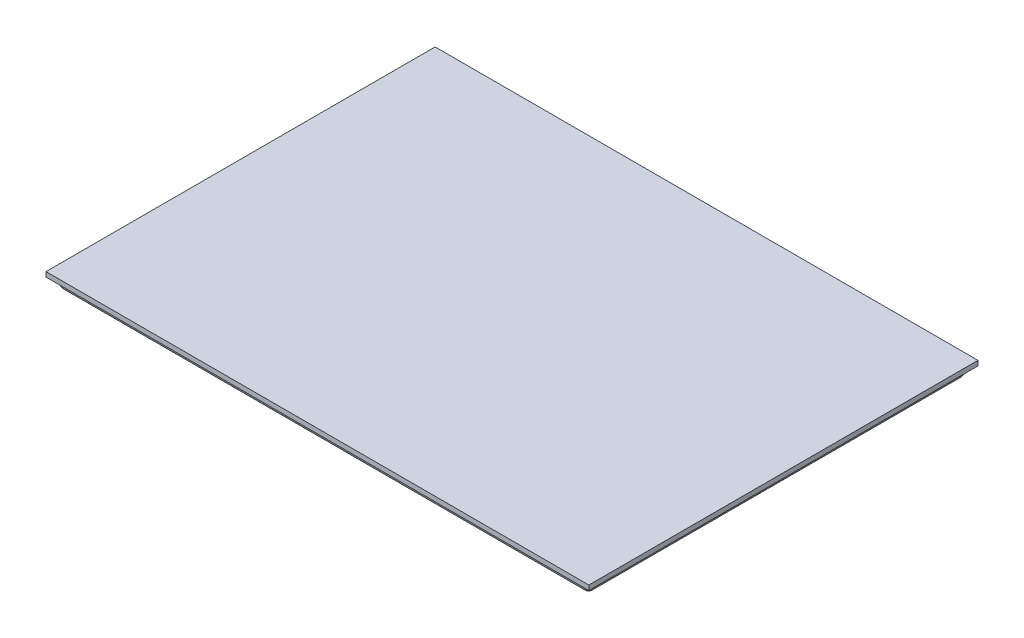
ISO-10303-21;
HEADER;
FILE_DESCRIPTION(('STEP AP214'),'2;1');
FILE_NAME('part.step','',(''),(''),'','','');
FILE_SCHEMA(('AUTOMOTIVE_DESIGN { 1 0 10303 214 1 1 1 1 }'));
ENDSEC;
DATA;
#1=APPLICATION_CONTEXT('core data for automotive mechanical design processes');
#2=APPLICATION_PROTOCOL_DEFINITION('international standard','automotive_design',2000,#1);
#3=PRODUCT_CONTEXT('',#1,'mechanical');
#4=PRODUCT('Part','Part','',(#3));
#5=PRODUCT_RELATED_PRODUCT_CATEGORY('part','',(#4));
#6=PRODUCT_DEFINITION_FORMATION('','',#4);
#7=PRODUCT_DEFINITION_CONTEXT('part definition',#1,'design');
#8=PRODUCT_DEFINITION('design','',#6,#7);
#9=PRODUCT_DEFINITION_SHAPE('','',#8);
#10=(LENGTH_UNIT() NAMED_UNIT(*) SI_UNIT(.MILLI.,.METRE.));
#11=(NAMED_UNIT(*) PLANE_ANGLE_UNIT() SI_UNIT($,.RADIAN.));
#12=(NAMED_UNIT(*) SI_UNIT($,.STERADIAN.) SOLID_ANGLE_UNIT());
#13=UNCERTAINTY_MEASURE_WITH_UNIT(LENGTH_MEASURE(1.E-05),#10,'distance_accuracy_value','');
#14=(GEOMETRIC_REPRESENTATION_CONTEXT(3) GLOBAL_UNCERTAINTY_ASSIGNED_CONTEXT((#13)) GLOBAL_UNIT_ASSIGNED_CONTEXT((#10,
#11,#12)) REPRESENTATION_CONTEXT('',''));
#15=CARTESIAN_POINT('',(0.,0.,0.));
#16=DIRECTION('',(0.,0.,1.));
#17=DIRECTION('',(1.,0.,0.));
#18=AXIS2_PLACEMENT_3D('',#15,#16,#17);
#19=CARTESIAN_POINT('',(56.5,1.,40.5));
#20=DIRECTION('',(-1.,0.,0.));
#21=DIRECTION('',(0.,0.,1.));
#22=AXIS2_PLACEMENT_3D('',#19,#20,#21);
#23=PLANE('',#22);
#24=DIRECTION('',(0.,0.,-1.));
#25=VECTOR('',#24,1.);
#26=CARTESIAN_POINT('',(56.5,0.,40.5));
#27=LINE('',#26,#25);
#28=CARTESIAN_POINT('',(56.5,0.,40.5));
#29=VERTEX_POINT('',#28);
#30=CARTESIAN_POINT('',(56.5,0.,-40.5));
#31=VERTEX_POINT('',#30);
#32=EDGE_CURVE('E158',#29,#31,#27,.T.);
#33=ORIENTED_EDGE('',*,*,#32,.T.);
#34=DIRECTION('',(0.,-1.,0.));
#35=VECTOR('',#34,1.);
#36=CARTESIAN_POINT('',(56.5,1.,-40.5));
#37=LINE('',#36,#35);
#38=CARTESIAN_POINT('',(56.5,1.,-40.5));
#39=VERTEX_POINT('',#38);
#40=EDGE_CURVE('E139',#39,#31,#37,.T.);
#41=ORIENTED_EDGE('',*,*,#40,.F.);
#42=DIRECTION('',(0.,0.,-1.));
#43=VECTOR('',#42,1.);
#44=CARTESIAN_POINT('',(56.5,1.,40.5));
#45=LINE('',#44,#43);
#46=CARTESIAN_POINT('',(56.5,1.,40.5));
#47=VERTEX_POINT('',#46);
#48=EDGE_CURVE('E146',#47,#39,#45,.T.);
#49=ORIENTED_EDGE('',*,*,#48,.F.);
#50=DIRECTION('',(0.,-1.,0.));
#51=VECTOR('',#50,1.);
#52=CARTESIAN_POINT('',(56.5,1.,40.5));
#53=LINE('',#52,#51);
#54=EDGE_CURVE('E250',#47,#29,#53,.T.);
#55=ORIENTED_EDGE('',*,*,#54,.T.);
#56=EDGE_LOOP('',(#33,#41,#49,#55));
#57=FACE_BOUND('',#56,.T.);
#58=ADVANCED_FACE('F33',(#57),#23,.F.);
#59=CARTESIAN_POINT('',(-56.5,1.,-40.5));
#60=DIRECTION('',(0.,0.,1.));
#61=DIRECTION('',(1.,0.,0.));
#62=AXIS2_PLACEMENT_3D('',#59,#60,#61);
#63=PLANE('',#62);
#64=DIRECTION('',(-1.,0.,0.));
#65=VECTOR('',#64,1.);
#66=CARTESIAN_POINT('',(-56.5,0.,-40.5));
#67=LINE('',#66,#65);
#68=CARTESIAN_POINT('',(-56.5,0.,-40.5));
#69=VERTEX_POINT('',#68);
#70=EDGE_CURVE('E252',#31,#69,#67,.T.);
#71=ORIENTED_EDGE('',*,*,#70,.T.);
#72=DIRECTION('',(0.,-1.,0.));
#73=VECTOR('',#72,1.);
#74=CARTESIAN_POINT('',(-56.5,1.,-40.5));
#75=LINE('',#74,#73);
#76=CARTESIAN_POINT('',(-56.5,1.,-40.5));
#77=VERTEX_POINT('',#76);
#78=EDGE_CURVE('E142',#77,#69,#75,.T.);
#79=ORIENTED_EDGE('',*,*,#78,.F.);
#80=DIRECTION('',(-1.,0.,0.));
#81=VECTOR('',#80,1.);
#82=CARTESIAN_POINT('',(-56.5,1.,-40.5));
#83=LINE('',#82,#81);
#84=EDGE_CURVE('E135',#39,#77,#83,.T.);
#85=ORIENTED_EDGE('',*,*,#84,.F.);
#86=ORIENTED_EDGE('',*,*,#40,.T.);
#87=EDGE_LOOP('',(#71,#79,#85,#86));
#88=FACE_BOUND('',#87,.T.);
#89=ADVANCED_FACE('F137',(#88),#63,.F.);
#90=CARTESIAN_POINT('',(-56.5,1.,40.5));
#91=DIRECTION('',(1.,0.,0.));
#92=DIRECTION('',(0.,0.,-1.));
#93=AXIS2_PLACEMENT_3D('',#90,#91,#92);
#94=PLANE('',#93);
#95=DIRECTION('',(0.,0.,1.));
#96=VECTOR('',#95,1.);
#97=CARTESIAN_POINT('',(-56.5,0.,40.5));
#98=LINE('',#97,#96);
#99=CARTESIAN_POINT('',(-56.5,0.,40.5));
#100=VERTEX_POINT('',#99);
#101=EDGE_CURVE('E254',#69,#100,#98,.T.);
#102=ORIENTED_EDGE('',*,*,#101,.T.);
#103=DIRECTION('',(0.,-1.,0.));
#104=VECTOR('',#103,1.);
#105=CARTESIAN_POINT('',(-56.5,1.,40.5));
#106=LINE('',#105,#104);
#107=CARTESIAN_POINT('',(-56.5,1.,40.5));
#108=VERTEX_POINT('',#107);
#109=EDGE_CURVE('E163',#108,#100,#106,.T.);
#110=ORIENTED_EDGE('',*,*,#109,.F.);
#111=DIRECTION('',(0.,0.,1.));
#112=VECTOR('',#111,1.);
#113=CARTESIAN_POINT('',(-56.5,1.,40.5));
#114=LINE('',#113,#112);
#115=EDGE_CURVE('E145',#77,#108,#114,.T.);
#116=ORIENTED_EDGE('',*,*,#115,.F.);
#117=ORIENTED_EDGE('',*,*,#78,.T.);
#118=EDGE_LOOP('',(#102,#110,#116,#117));
#119=FACE_BOUND('',#118,.T.);
#120=ADVANCED_FACE('F266',(#119),#94,.F.);
#121=CARTESIAN_POINT('',(-56.5,1.,40.5));
#122=DIRECTION('',(0.,0.,-1.));
#123=DIRECTION('',(-1.,0.,0.));
#124=AXIS2_PLACEMENT_3D('',#121,#122,#123);
#125=PLANE('',#124);
#126=DIRECTION('',(1.,0.,0.));
#127=VECTOR('',#126,1.);
#128=CARTESIAN_POINT('',(-56.5,0.,40.5));
#129=LINE('',#128,#127);
#130=EDGE_CURVE('E155',#100,#29,#129,.T.);
#131=ORIENTED_EDGE('',*,*,#130,.T.);
#132=ORIENTED_EDGE('',*,*,#54,.F.);
#133=DIRECTION('',(1.,0.,0.));
#134=VECTOR('',#133,1.);
#135=CARTESIAN_POINT('',(-56.5,1.,40.5));
#136=LINE('',#135,#134);
#137=EDGE_CURVE('E151',#108,#47,#136,.T.);
#138=ORIENTED_EDGE('',*,*,#137,.F.);
#139=ORIENTED_EDGE('',*,*,#109,.T.);
#140=EDGE_LOOP('',(#131,#132,#138,#139));
#141=FACE_BOUND('',#140,.T.);
#142=ADVANCED_FACE('F261',(#141),#125,.F.);
#143=CARTESIAN_POINT('',(0.,1.,0.));
#144=DIRECTION('',(0.,-1.,0.));
#145=DIRECTION('',(0.,0.,-1.));
#146=AXIS2_PLACEMENT_3D('',#143,#144,#145);
#147=PLANE('',#146);
#148=ORIENTED_EDGE('',*,*,#48,.T.);
#149=ORIENTED_EDGE('',*,*,#84,.T.);
#150=ORIENTED_EDGE('',*,*,#115,.T.);
#151=ORIENTED_EDGE('',*,*,#137,.T.);
#152=EDGE_LOOP('',(#148,#149,#150,#151));
#153=FACE_BOUND('',#152,.T.);
#154=ADVANCED_FACE('F149',(#153),#147,.F.);
#155=CARTESIAN_POINT('',(0.,0.,0.));
#156=DIRECTION('',(0.,-1.,0.));
#157=DIRECTION('',(0.,0.,-1.));
#158=AXIS2_PLACEMENT_3D('',#155,#156,#157);
#159=PLANE('',#158);
#160=DIRECTION('',(0.,0.,1.));
#161=VECTOR('',#160,1.);
#162=CARTESIAN_POINT('',(55.35,0.,-39.4));
#163=LINE('',#162,#161);
#164=CARTESIAN_POINT('',(55.35,0.,-38.4));
#165=VERTEX_POINT('',#164);
#166=CARTESIAN_POINT('',(55.35,0.,38.4));
#167=VERTEX_POINT('',#166);
#168=EDGE_CURVE('E234',#165,#167,#163,.T.);
#169=ORIENTED_EDGE('',*,*,#168,.F.);
#170=CARTESIAN_POINT('',(54.35,0.,-38.4));
#171=DIRECTION('',(0.,-1.,0.));
#172=DIRECTION('',(0.,0.,-1.));
#173=AXIS2_PLACEMENT_3D('',#170,#171,#172);
#174=CIRCLE('',#173,1.);
#175=CARTESIAN_POINT('',(54.35,0.,-39.4));
#176=VERTEX_POINT('',#175);
#177=EDGE_CURVE('E11',#165,#176,#174,.F.);
#178=ORIENTED_EDGE('',*,*,#177,.T.);
#179=DIRECTION('',(1.,0.,0.));
#180=VECTOR('',#179,1.);
#181=CARTESIAN_POINT('',(-55.35,0.,-39.4));
#182=LINE('',#181,#180);
#183=CARTESIAN_POINT('',(-54.35,0.,-39.4));
#184=VERTEX_POINT('',#183);
#185=EDGE_CURVE('E245',#184,#176,#182,.T.);
#186=ORIENTED_EDGE('',*,*,#185,.F.);
#187=CARTESIAN_POINT('',(-54.35,0.,-38.4));
#188=DIRECTION('',(0.,-1.,0.));
#189=DIRECTION('',(0.,0.,-1.));
#190=AXIS2_PLACEMENT_3D('',#187,#188,#189);
#191=CIRCLE('',#190,1.);
#192=CARTESIAN_POINT('',(-55.35,0.,-38.4));
#193=VERTEX_POINT('',#192);
#194=EDGE_CURVE('E196',#184,#193,#191,.F.);
#195=ORIENTED_EDGE('',*,*,#194,.T.);
#196=DIRECTION('',(0.,0.,-1.));
#197=VECTOR('',#196,1.);
#198=CARTESIAN_POINT('',(-55.35,0.,-39.4));
#199=LINE('',#198,#197);
#200=CARTESIAN_POINT('',(-55.35,0.,38.4));
#201=VERTEX_POINT('',#200);
#202=EDGE_CURVE('E240',#201,#193,#199,.T.);
#203=ORIENTED_EDGE('',*,*,#202,.F.);
#204=CARTESIAN_POINT('',(-54.35,0.,38.4));
#205=DIRECTION('',(0.,-1.,0.));
#206=DIRECTION('',(0.,0.,-1.));
#207=AXIS2_PLACEMENT_3D('',#204,#205,#206);
#208=CIRCLE('',#207,1.);
#209=CARTESIAN_POINT('',(-54.35,0.,39.4));
#210=VERTEX_POINT('',#209);
#211=EDGE_CURVE('E198',#201,#210,#208,.F.);
#212=ORIENTED_EDGE('',*,*,#211,.T.);
#213=DIRECTION('',(-1.,0.,0.));
#214=VECTOR('',#213,1.);
#215=CARTESIAN_POINT('',(-55.35,0.,39.4));
#216=LINE('',#215,#214);
#217=CARTESIAN_POINT('',(54.35,0.,39.4));
#218=VERTEX_POINT('',#217);
#219=EDGE_CURVE('E236',#218,#210,#216,.T.);
#220=ORIENTED_EDGE('',*,*,#219,.F.);
#221=CARTESIAN_POINT('',(54.35,0.,38.4));
#222=DIRECTION('',(0.,-1.,0.));
#223=DIRECTION('',(0.,0.,-1.));
#224=AXIS2_PLACEMENT_3D('',#221,#222,#223);
#225=CIRCLE('',#224,1.);
#226=EDGE_CURVE('E42',#218,#167,#225,.F.);
#227=ORIENTED_EDGE('',*,*,#226,.T.);
#228=EDGE_LOOP('',(#169,#178,#186,#195,#203,#212,#220,#227));
#229=FACE_BOUND('',#228,.T.);
#230=ORIENTED_EDGE('',*,*,#32,.F.);
#231=ORIENTED_EDGE('',*,*,#130,.F.);
#232=ORIENTED_EDGE('',*,*,#101,.F.);
#233=ORIENTED_EDGE('',*,*,#70,.F.);
#234=EDGE_LOOP('',(#230,#231,#232,#233));
#235=FACE_BOUND('',#234,.T.);
#236=ADVANCED_FACE('F265',(#229,#235),#159,.T.);
#237=CARTESIAN_POINT('',(55.35,-2.,-39.4));
#238=DIRECTION('',(-1.,0.,0.));
#239=DIRECTION('',(0.,0.,1.));
#240=AXIS2_PLACEMENT_3D('',#237,#238,#239);
#241=PLANE('',#240);
#242=ORIENTED_EDGE('',*,*,#168,.T.);
#243=DIRECTION('',(0.,1.,0.));
#244=VECTOR('',#243,1.);
#245=CARTESIAN_POINT('',(55.35,-2.,38.4));
#246=LINE('',#245,#244);
#247=CARTESIAN_POINT('',(55.35,-1.,38.4));
#248=VERTEX_POINT('',#247);
#249=EDGE_CURVE('E50',#167,#248,#246,.F.);
#250=ORIENTED_EDGE('',*,*,#249,.T.);
#251=DIRECTION('',(0.,0.,1.));
#252=VECTOR('',#251,1.);
#253=CARTESIAN_POINT('',(55.35,-1.,-39.4));
#254=LINE('',#253,#252);
#255=CARTESIAN_POINT('',(55.35,-1.,-38.4));
#256=VERTEX_POINT('',#255);
#257=EDGE_CURVE('E55',#248,#256,#254,.F.);
#258=ORIENTED_EDGE('',*,*,#257,.T.);
#259=DIRECTION('',(0.,1.,0.));
#260=VECTOR('',#259,1.);
#261=CARTESIAN_POINT('',(55.35,-2.,-38.4));
#262=LINE('',#261,#260);
#263=EDGE_CURVE('E192',#256,#165,#262,.T.);
#264=ORIENTED_EDGE('',*,*,#263,.T.);
#265=EDGE_LOOP('',(#242,#250,#258,#264));
#266=FACE_BOUND('',#265,.T.);
#267=ADVANCED_FACE('F373',(#266),#241,.F.);
#268=CARTESIAN_POINT('',(-55.35,-2.,39.4));
#269=DIRECTION('',(0.,0.,-1.));
#270=DIRECTION('',(-1.,0.,0.));
#271=AXIS2_PLACEMENT_3D('',#268,#269,#270);
#272=PLANE('',#271);
#273=ORIENTED_EDGE('',*,*,#219,.T.);
#274=DIRECTION('',(0.,1.,0.));
#275=VECTOR('',#274,1.);
#276=CARTESIAN_POINT('',(-54.35,-2.,39.4));
#277=LINE('',#276,#275);
#278=CARTESIAN_POINT('',(-54.35,-1.,39.4));
#279=VERTEX_POINT('',#278);
#280=EDGE_CURVE('E190',#210,#279,#277,.F.);
#281=ORIENTED_EDGE('',*,*,#280,.T.);
#282=DIRECTION('',(-1.,0.,0.));
#283=VECTOR('',#282,1.);
#284=CARTESIAN_POINT('',(-55.35,-1.,39.4));
#285=LINE('',#284,#283);
#286=CARTESIAN_POINT('',(54.35,-1.,39.4));
#287=VERTEX_POINT('',#286);
#288=EDGE_CURVE('E188',#279,#287,#285,.F.);
#289=ORIENTED_EDGE('',*,*,#288,.T.);
#290=DIRECTION('',(0.,1.,0.));
#291=VECTOR('',#290,1.);
#292=CARTESIAN_POINT('',(54.35,-2.,39.4));
#293=LINE('',#292,#291);
#294=EDGE_CURVE('E186',#287,#218,#293,.T.);
#295=ORIENTED_EDGE('',*,*,#294,.T.);
#296=EDGE_LOOP('',(#273,#281,#289,#295));
#297=FACE_BOUND('',#296,.T.);
#298=ADVANCED_FACE('F334',(#297),#272,.F.);
#299=CARTESIAN_POINT('',(-55.35,-2.,-39.4));
#300=DIRECTION('',(1.,0.,0.));
#301=DIRECTION('',(0.,0.,-1.));
#302=AXIS2_PLACEMENT_3D('',#299,#300,#301);
#303=PLANE('',#302);
#304=ORIENTED_EDGE('',*,*,#202,.T.);
#305=DIRECTION('',(0.,1.,0.));
#306=VECTOR('',#305,1.);
#307=CARTESIAN_POINT('',(-55.35,-2.,-38.4));
#308=LINE('',#307,#306);
#309=CARTESIAN_POINT('',(-55.35,-1.,-38.4));
#310=VERTEX_POINT('',#309);
#311=EDGE_CURVE('E184',#193,#310,#308,.F.);
#312=ORIENTED_EDGE('',*,*,#311,.T.);
#313=DIRECTION('',(0.,0.,-1.));
#314=VECTOR('',#313,1.);
#315=CARTESIAN_POINT('',(-55.35,-1.,-39.4));
#316=LINE('',#315,#314);
#317=CARTESIAN_POINT('',(-55.35,-1.,38.4));
#318=VERTEX_POINT('',#317);
#319=EDGE_CURVE('E182',#310,#318,#316,.F.);
#320=ORIENTED_EDGE('',*,*,#319,.T.);
#321=DIRECTION('',(0.,1.,0.));
#322=VECTOR('',#321,1.);
#323=CARTESIAN_POINT('',(-55.35,-2.,38.4));
#324=LINE('',#323,#322);
#325=EDGE_CURVE('E180',#318,#201,#324,.T.);
#326=ORIENTED_EDGE('',*,*,#325,.T.);
#327=EDGE_LOOP('',(#304,#312,#320,#326));
#328=FACE_BOUND('',#327,.T.);
#329=ADVANCED_FACE('F341',(#328),#303,.F.);
#330=CARTESIAN_POINT('',(-55.35,-2.,-39.4));
#331=DIRECTION('',(0.,0.,1.));
#332=DIRECTION('',(1.,0.,0.));
#333=AXIS2_PLACEMENT_3D('',#330,#331,#332);
#334=PLANE('',#333);
#335=DIRECTION('',(1.,0.,0.));
#336=VECTOR('',#335,1.);
#337=CARTESIAN_POINT('',(-55.35,-1.,-39.4));
#338=LINE('',#337,#336);
#339=CARTESIAN_POINT('',(54.35,-1.,-39.4));
#340=VERTEX_POINT('',#339);
#341=CARTESIAN_POINT('',(-54.35,-1.,-39.4));
#342=VERTEX_POINT('',#341);
#343=EDGE_CURVE('E175',#340,#342,#338,.F.);
#344=ORIENTED_EDGE('',*,*,#343,.T.);
#345=DIRECTION('',(0.,1.,0.));
#346=VECTOR('',#345,1.);
#347=CARTESIAN_POINT('',(-54.35,-2.,-39.4));
#348=LINE('',#347,#346);
#349=EDGE_CURVE('E178',#342,#184,#348,.T.);
#350=ORIENTED_EDGE('',*,*,#349,.T.);
#351=ORIENTED_EDGE('',*,*,#185,.T.);
#352=DIRECTION('',(0.,1.,0.));
#353=VECTOR('',#352,1.);
#354=CARTESIAN_POINT('',(54.35,-2.,-39.4));
#355=LINE('',#354,#353);
#356=EDGE_CURVE('E173',#176,#340,#355,.F.);
#357=ORIENTED_EDGE('',*,*,#356,.T.);
#358=EDGE_LOOP('',(#344,#350,#351,#357));
#359=FACE_BOUND('',#358,.T.);
#360=ADVANCED_FACE('F360',(#359),#334,.F.);
#361=CARTESIAN_POINT('',(0.,-2.,0.));
#362=DIRECTION('',(0.,1.,0.));
#363=DIRECTION('',(0.,0.,1.));
#364=AXIS2_PLACEMENT_3D('',#361,#362,#363);
#365=PLANE('',#364);
#366=DIRECTION('',(0.,0.,-1.));
#367=VECTOR('',#366,1.);
#368=CARTESIAN_POINT('',(-54.35,-2.,0.));
#369=LINE('',#368,#367);
#370=CARTESIAN_POINT('',(-54.35,-2.,38.4));
#371=VERTEX_POINT('',#370);
#372=CARTESIAN_POINT('',(-54.35,-2.,-38.4));
#373=VERTEX_POINT('',#372);
#374=EDGE_CURVE('E168',#371,#373,#369,.T.);
#375=ORIENTED_EDGE('',*,*,#374,.T.);
#376=DIRECTION('',(1.,0.,0.));
#377=VECTOR('',#376,1.);
#378=CARTESIAN_POINT('',(0.,-2.,-38.4));
#379=LINE('',#378,#377);
#380=CARTESIAN_POINT('',(54.35,-2.,-38.4));
#381=VERTEX_POINT('',#380);
#382=EDGE_CURVE('E170',#373,#381,#379,.T.);
#383=ORIENTED_EDGE('',*,*,#382,.T.);
#384=DIRECTION('',(0.,0.,1.));
#385=VECTOR('',#384,1.);
#386=CARTESIAN_POINT('',(54.35,-2.,0.));
#387=LINE('',#386,#385);
#388=CARTESIAN_POINT('',(54.35,-2.,38.4));
#389=VERTEX_POINT('',#388);
#390=EDGE_CURVE('E159',#381,#389,#387,.T.);
#391=ORIENTED_EDGE('',*,*,#390,.T.);
#392=DIRECTION('',(-1.,0.,0.));
#393=VECTOR('',#392,1.);
#394=CARTESIAN_POINT('',(0.,-2.,38.4));
#395=LINE('',#394,#393);
#396=EDGE_CURVE('E161',#389,#371,#395,.T.);
#397=ORIENTED_EDGE('',*,*,#396,.T.);
#398=EDGE_LOOP('',(#375,#383,#391,#397));
#399=FACE_BOUND('',#398,.T.);
#400=ADVANCED_FACE('F324',(#399),#365,.F.);
#401=CARTESIAN_POINT('',(-54.35,-2.,38.4));
#402=DIRECTION('',(0.,1.,0.));
#403=DIRECTION('',(0.,0.,1.));
#404=AXIS2_PLACEMENT_3D('',#401,#402,#403);
#405=CYLINDRICAL_SURFACE('',#404,1.);
#406=ORIENTED_EDGE('',*,*,#211,.F.);
#407=ORIENTED_EDGE('',*,*,#325,.F.);
#408=CARTESIAN_POINT('',(-54.35,-1.,38.4));
#409=DIRECTION('',(0.,-1.,0.));
#410=DIRECTION('',(0.,0.,-1.));
#411=AXIS2_PLACEMENT_3D('',#408,#409,#410);
#412=CIRCLE('',#411,1.);
#413=EDGE_CURVE('E37',#279,#318,#412,.T.);
#414=ORIENTED_EDGE('',*,*,#413,.F.);
#415=ORIENTED_EDGE('',*,*,#280,.F.);
#416=EDGE_LOOP('',(#406,#407,#414,#415));
#417=FACE_BOUND('',#416,.T.);
#418=ADVANCED_FACE('F35',(#417),#405,.T.);
#419=CARTESIAN_POINT('',(0.,-1.,38.4));
#420=DIRECTION('',(-1.,0.,0.));
#421=DIRECTION('',(0.,0.,1.));
#422=AXIS2_PLACEMENT_3D('',#419,#420,#421);
#423=CYLINDRICAL_SURFACE('',#422,1.);
#424=CARTESIAN_POINT('',(54.35,-1.,38.4));
#425=DIRECTION('',(1.,0.,0.));
#426=DIRECTION('',(0.,1.,0.));
#427=AXIS2_PLACEMENT_3D('',#424,#425,#426);
#428=CIRCLE('',#427,1.);
#429=EDGE_CURVE('E226',#287,#389,#428,.T.);
#430=ORIENTED_EDGE('',*,*,#429,.F.);
#431=ORIENTED_EDGE('',*,*,#288,.F.);
#432=CARTESIAN_POINT('',(-54.35,-1.,38.4));
#433=DIRECTION('',(-1.,0.,0.));
#434=DIRECTION('',(0.,0.,1.));
#435=AXIS2_PLACEMENT_3D('',#432,#433,#434);
#436=CIRCLE('',#435,1.);
#437=EDGE_CURVE('E228',#371,#279,#436,.T.);
#438=ORIENTED_EDGE('',*,*,#437,.F.);
#439=ORIENTED_EDGE('',*,*,#396,.F.);
#440=EDGE_LOOP('',(#430,#431,#438,#439));
#441=FACE_BOUND('',#440,.T.);
#442=ADVANCED_FACE('F317',(#441),#423,.T.);
#443=CARTESIAN_POINT('',(54.35,-2.,38.4));
#444=DIRECTION('',(0.,1.,0.));
#445=DIRECTION('',(0.,0.,1.));
#446=AXIS2_PLACEMENT_3D('',#443,#444,#445);
#447=CYLINDRICAL_SURFACE('',#446,1.);
#448=ORIENTED_EDGE('',*,*,#226,.F.);
#449=ORIENTED_EDGE('',*,*,#294,.F.);
#450=CARTESIAN_POINT('',(54.35,-1.,38.4));
#451=DIRECTION('',(0.,-1.,0.));
#452=DIRECTION('',(0.,0.,-1.));
#453=AXIS2_PLACEMENT_3D('',#450,#451,#452);
#454=CIRCLE('',#453,1.);
#455=EDGE_CURVE('E223',#248,#287,#454,.T.);
#456=ORIENTED_EDGE('',*,*,#455,.F.);
#457=ORIENTED_EDGE('',*,*,#249,.F.);
#458=EDGE_LOOP('',(#448,#449,#456,#457));
#459=FACE_BOUND('',#458,.T.);
#460=ADVANCED_FACE('F315',(#459),#447,.T.);
#461=CARTESIAN_POINT('',(-54.35,-1.,38.4));
#462=DIRECTION('',(0.,0.,1.));
#463=DIRECTION('',(1.,0.,0.));
#464=AXIS2_PLACEMENT_3D('',#461,#462,#463);
#465=SPHERICAL_SURFACE('',#464,1.);
#466=ORIENTED_EDGE('',*,*,#437,.T.);
#467=ORIENTED_EDGE('',*,*,#413,.T.);
#468=CARTESIAN_POINT('',(-54.35,-1.,38.4));
#469=DIRECTION('',(0.,0.,1.));
#470=DIRECTION('',(0.,-1.,0.));
#471=AXIS2_PLACEMENT_3D('',#468,#469,#470);
#472=CIRCLE('',#471,1.);
#473=EDGE_CURVE('E220',#371,#318,#472,.F.);
#474=ORIENTED_EDGE('',*,*,#473,.F.);
#475=EDGE_LOOP('',(#466,#467,#474));
#476=FACE_BOUND('',#475,.T.);
#477=ADVANCED_FACE('F311',(#476),#465,.T.);
#478=CARTESIAN_POINT('',(54.35,-1.,38.4));
#479=DIRECTION('',(0.,0.,1.));
#480=DIRECTION('',(1.,0.,0.));
#481=AXIS2_PLACEMENT_3D('',#478,#479,#480);
#482=SPHERICAL_SURFACE('',#481,1.);
#483=ORIENTED_EDGE('',*,*,#455,.T.);
#484=ORIENTED_EDGE('',*,*,#429,.T.);
#485=CARTESIAN_POINT('',(54.35,-1.,38.4));
#486=DIRECTION('',(0.,0.,1.));
#487=DIRECTION('',(1.,0.,0.));
#488=AXIS2_PLACEMENT_3D('',#485,#486,#487);
#489=CIRCLE('',#488,1.);
#490=EDGE_CURVE('E217',#248,#389,#489,.F.);
#491=ORIENTED_EDGE('',*,*,#490,.F.);
#492=EDGE_LOOP('',(#483,#484,#491));
#493=FACE_BOUND('',#492,.T.);
#494=ADVANCED_FACE('F307',(#493),#482,.T.);
#495=CARTESIAN_POINT('',(-54.35,-2.,-38.4));
#496=DIRECTION('',(0.,1.,0.));
#497=DIRECTION('',(0.,0.,1.));
#498=AXIS2_PLACEMENT_3D('',#495,#496,#497);
#499=CYLINDRICAL_SURFACE('',#498,1.);
#500=ORIENTED_EDGE('',*,*,#194,.F.);
#501=ORIENTED_EDGE('',*,*,#349,.F.);
#502=CARTESIAN_POINT('',(-54.35,-1.,-38.4));
#503=DIRECTION('',(0.,-1.,0.));
#504=DIRECTION('',(0.,0.,-1.));
#505=AXIS2_PLACEMENT_3D('',#502,#503,#504);
#506=CIRCLE('',#505,1.);
#507=EDGE_CURVE('E214',#310,#342,#506,.T.);
#508=ORIENTED_EDGE('',*,*,#507,.F.);
#509=ORIENTED_EDGE('',*,*,#311,.F.);
#510=EDGE_LOOP('',(#500,#501,#508,#509));
#511=FACE_BOUND('',#510,.T.);
#512=ADVANCED_FACE('F303',(#511),#499,.T.);
#513=CARTESIAN_POINT('',(-54.35,-1.,0.));
#514=DIRECTION('',(0.,0.,-1.));
#515=DIRECTION('',(-1.,0.,0.));
#516=AXIS2_PLACEMENT_3D('',#513,#514,#515);
#517=CYLINDRICAL_SURFACE('',#516,1.);
#518=ORIENTED_EDGE('',*,*,#473,.T.);
#519=ORIENTED_EDGE('',*,*,#319,.F.);
#520=CARTESIAN_POINT('',(-54.35,-1.,-38.4));
#521=DIRECTION('',(0.,0.,-1.));
#522=DIRECTION('',(-1.,0.,0.));
#523=AXIS2_PLACEMENT_3D('',#520,#521,#522);
#524=CIRCLE('',#523,1.);
#525=EDGE_CURVE('E211',#373,#310,#524,.T.);
#526=ORIENTED_EDGE('',*,*,#525,.F.);
#527=ORIENTED_EDGE('',*,*,#374,.F.);
#528=EDGE_LOOP('',(#518,#519,#526,#527));
#529=FACE_BOUND('',#528,.T.);
#530=ADVANCED_FACE('F299',(#529),#517,.T.);
#531=CARTESIAN_POINT('',(54.35,-1.,0.));
#532=DIRECTION('',(0.,0.,1.));
#533=DIRECTION('',(1.,0.,0.));
#534=AXIS2_PLACEMENT_3D('',#531,#532,#533);
#535=CYLINDRICAL_SURFACE('',#534,1.);
#536=ORIENTED_EDGE('',*,*,#490,.T.);
#537=ORIENTED_EDGE('',*,*,#390,.F.);
#538=CARTESIAN_POINT('',(54.35,-1.,-38.4));
#539=DIRECTION('',(0.,0.,-1.));
#540=DIRECTION('',(-1.,0.,0.));
#541=AXIS2_PLACEMENT_3D('',#538,#539,#540);
#542=CIRCLE('',#541,1.);
#543=EDGE_CURVE('E208',#256,#381,#542,.T.);
#544=ORIENTED_EDGE('',*,*,#543,.F.);
#545=ORIENTED_EDGE('',*,*,#257,.F.);
#546=EDGE_LOOP('',(#536,#537,#544,#545));
#547=FACE_BOUND('',#546,.T.);
#548=ADVANCED_FACE('F295',(#547),#535,.T.);
#549=CARTESIAN_POINT('',(54.35,-2.,-38.4));
#550=DIRECTION('',(0.,1.,0.));
#551=DIRECTION('',(0.,0.,1.));
#552=AXIS2_PLACEMENT_3D('',#549,#550,#551);
#553=CYLINDRICAL_SURFACE('',#552,1.);
#554=ORIENTED_EDGE('',*,*,#177,.F.);
#555=ORIENTED_EDGE('',*,*,#263,.F.);
#556=CARTESIAN_POINT('',(54.35,-1.,-38.4));
#557=DIRECTION('',(0.,-1.,0.));
#558=DIRECTION('',(0.,0.,-1.));
#559=AXIS2_PLACEMENT_3D('',#556,#557,#558);
#560=CIRCLE('',#559,1.);
#561=EDGE_CURVE('E205',#340,#256,#560,.T.);
#562=ORIENTED_EDGE('',*,*,#561,.F.);
#563=ORIENTED_EDGE('',*,*,#356,.F.);
#564=EDGE_LOOP('',(#554,#555,#562,#563));
#565=FACE_BOUND('',#564,.T.);
#566=ADVANCED_FACE('F291',(#565),#553,.T.);
#567=CARTESIAN_POINT('',(-54.35,-1.,-38.4));
#568=DIRECTION('',(0.,0.,1.));
#569=DIRECTION('',(1.,0.,0.));
#570=AXIS2_PLACEMENT_3D('',#567,#568,#569);
#571=SPHERICAL_SURFACE('',#570,1.);
#572=ORIENTED_EDGE('',*,*,#525,.T.);
#573=ORIENTED_EDGE('',*,*,#507,.T.);
#574=CARTESIAN_POINT('',(-54.35,-1.,-38.4));
#575=DIRECTION('',(-1.,0.,0.));
#576=DIRECTION('',(0.,0.,1.));
#577=AXIS2_PLACEMENT_3D('',#574,#575,#576);
#578=CIRCLE('',#577,1.);
#579=EDGE_CURVE('E203',#373,#342,#578,.F.);
#580=ORIENTED_EDGE('',*,*,#579,.F.);
#581=EDGE_LOOP('',(#572,#573,#580));
#582=FACE_BOUND('',#581,.T.);
#583=ADVANCED_FACE('F287',(#582),#571,.T.);
#584=CARTESIAN_POINT('',(54.35,-1.,-38.4));
#585=DIRECTION('',(0.,0.,1.));
#586=DIRECTION('',(1.,0.,0.));
#587=AXIS2_PLACEMENT_3D('',#584,#585,#586);
#588=SPHERICAL_SURFACE('',#587,1.);
#589=ORIENTED_EDGE('',*,*,#561,.T.);
#590=ORIENTED_EDGE('',*,*,#543,.T.);
#591=CARTESIAN_POINT('',(54.35,-1.,-38.4));
#592=DIRECTION('',(1.,0.,0.));
#593=DIRECTION('',(0.,0.,-1.));
#594=AXIS2_PLACEMENT_3D('',#591,#592,#593);
#595=CIRCLE('',#594,1.);
#596=EDGE_CURVE('E201',#340,#381,#595,.F.);
#597=ORIENTED_EDGE('',*,*,#596,.F.);
#598=EDGE_LOOP('',(#589,#590,#597));
#599=FACE_BOUND('',#598,.T.);
#600=ADVANCED_FACE('F283',(#599),#588,.T.);
#601=CARTESIAN_POINT('',(0.,-1.,-38.4));
#602=DIRECTION('',(1.,0.,0.));
#603=DIRECTION('',(0.,0.,-1.));
#604=AXIS2_PLACEMENT_3D('',#601,#602,#603);
#605=CYLINDRICAL_SURFACE('',#604,1.);
#606=ORIENTED_EDGE('',*,*,#579,.T.);
#607=ORIENTED_EDGE('',*,*,#343,.F.);
#608=ORIENTED_EDGE('',*,*,#596,.T.);
#609=ORIENTED_EDGE('',*,*,#382,.F.);
#610=EDGE_LOOP('',(#606,#607,#608,#609));
#611=FACE_BOUND('',#610,.T.);
#612=ADVANCED_FACE('F280',(#611),#605,.T.);
#613=CLOSED_SHELL('',(#58,#89,#120,#142,#154,#236,#267,#298,#329,#360,#400,#418,#442,#460,#477,
#494,#512,#530,#548,#566,#583,#600,#612));
#614=MANIFOLD_SOLID_BREP('B2',#613);
#615=ADVANCED_BREP_SHAPE_REPRESENTATION('',(#18,#614),#14);
#616=SHAPE_DEFINITION_REPRESENTATION(#9,#615);
ENDSEC;
END-ISO-10303-21;
